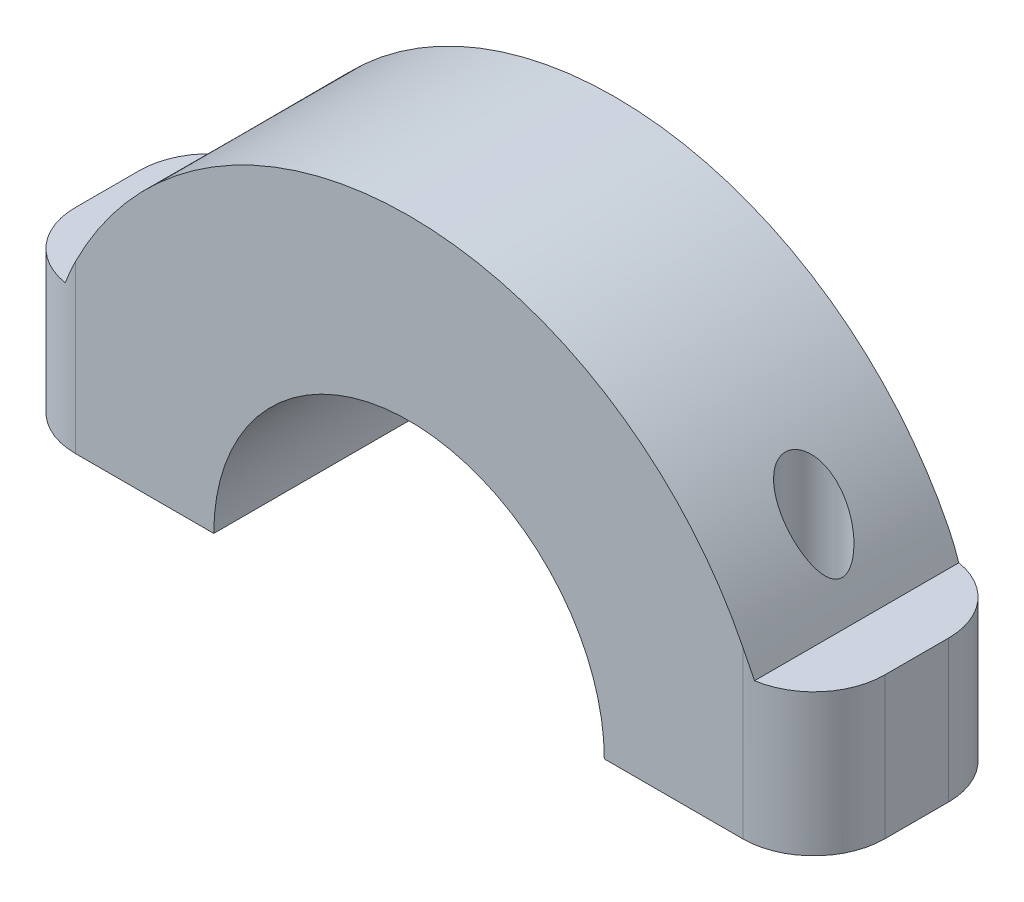
ISO-10303-21;
HEADER;
FILE_DESCRIPTION(('STEP AP214'),'2;1');
FILE_NAME('part.step','',(''),(''),'','','');
FILE_SCHEMA(('AUTOMOTIVE_DESIGN { 1 0 10303 214 1 1 1 1 }'));
ENDSEC;
DATA;
#1=APPLICATION_CONTEXT('core data for automotive mechanical design processes');
#2=APPLICATION_PROTOCOL_DEFINITION('international standard','automotive_design',2000,#1);
#3=PRODUCT_CONTEXT('',#1,'mechanical');
#4=PRODUCT('Part','Part','',(#3));
#5=PRODUCT_RELATED_PRODUCT_CATEGORY('part','',(#4));
#6=PRODUCT_DEFINITION_FORMATION('','',#4);
#7=PRODUCT_DEFINITION_CONTEXT('part definition',#1,'design');
#8=PRODUCT_DEFINITION('design','',#6,#7);
#9=PRODUCT_DEFINITION_SHAPE('','',#8);
#10=(LENGTH_UNIT() NAMED_UNIT(*) SI_UNIT(.MILLI.,.METRE.));
#11=(NAMED_UNIT(*) PLANE_ANGLE_UNIT() SI_UNIT($,.RADIAN.));
#12=(NAMED_UNIT(*) SI_UNIT($,.STERADIAN.) SOLID_ANGLE_UNIT());
#13=UNCERTAINTY_MEASURE_WITH_UNIT(LENGTH_MEASURE(1.E-05),#10,'distance_accuracy_value','');
#14=(GEOMETRIC_REPRESENTATION_CONTEXT(3) GLOBAL_UNCERTAINTY_ASSIGNED_CONTEXT((#13)) GLOBAL_UNIT_ASSIGNED_CONTEXT((#10,
#11,#12)) REPRESENTATION_CONTEXT('',''));
#15=CARTESIAN_POINT('',(0.,0.,0.));
#16=DIRECTION('',(0.,0.,1.));
#17=DIRECTION('',(1.,0.,0.));
#18=AXIS2_PLACEMENT_3D('',#15,#16,#17);
#19=CARTESIAN_POINT('',(-11.4,4.,-2.9));
#20=DIRECTION('',(1.,0.,0.));
#21=DIRECTION('',(0.,0.,-1.));
#22=AXIS2_PLACEMENT_3D('',#19,#20,#21);
#23=PLANE('',#22);
#24=DIRECTION('',(0.,0.,1.));
#25=VECTOR('',#24,1.);
#26=CARTESIAN_POINT('',(-11.4,4.,-2.9));
#27=LINE('',#26,#25);
#28=CARTESIAN_POINT('',(-11.4,4.,-0.900000000000001));
#29=VERTEX_POINT('',#28);
#30=CARTESIAN_POINT('',(-11.4,4.,0.900000000000002));
#31=VERTEX_POINT('',#30);
#32=EDGE_CURVE('E177',#29,#31,#27,.T.);
#33=ORIENTED_EDGE('',*,*,#32,.F.);
#34=DIRECTION('',(0.,-1.,0.));
#35=VECTOR('',#34,1.);
#36=CARTESIAN_POINT('',(-11.4,4.,-0.900000000000001));
#37=LINE('',#36,#35);
#38=CARTESIAN_POINT('',(-11.4,0.,-0.900000000000001));
#39=VERTEX_POINT('',#38);
#40=EDGE_CURVE('E320',#29,#39,#37,.T.);
#41=ORIENTED_EDGE('',*,*,#40,.T.);
#42=DIRECTION('',(0.,0.,1.));
#43=VECTOR('',#42,1.);
#44=CARTESIAN_POINT('',(-11.4,0.,-2.9));
#45=LINE('',#44,#43);
#46=CARTESIAN_POINT('',(-11.4,0.,0.900000000000002));
#47=VERTEX_POINT('',#46);
#48=EDGE_CURVE('E175',#39,#47,#45,.T.);
#49=ORIENTED_EDGE('',*,*,#48,.T.);
#50=DIRECTION('',(0.,-1.,0.));
#51=VECTOR('',#50,1.);
#52=CARTESIAN_POINT('',(-11.4,4.,0.900000000000002));
#53=LINE('',#52,#51);
#54=EDGE_CURVE('E69',#47,#31,#53,.F.);
#55=ORIENTED_EDGE('',*,*,#54,.T.);
#56=EDGE_LOOP('',(#33,#41,#49,#55));
#57=FACE_BOUND('',#56,.T.);
#58=ADVANCED_FACE('F47',(#57),#23,.F.);
#59=CARTESIAN_POINT('',(-11.4,4.,2.9));
#60=DIRECTION('',(0.,0.,-1.));
#61=DIRECTION('',(-1.,0.,0.));
#62=AXIS2_PLACEMENT_3D('',#59,#60,#61);
#63=PLANE('',#62);
#64=DIRECTION('',(1.,0.,0.));
#65=VECTOR('',#64,1.);
#66=CARTESIAN_POINT('',(5.5,0.,2.9));
#67=LINE('',#66,#65);
#68=CARTESIAN_POINT('',(5.5,0.,2.9));
#69=VERTEX_POINT('',#68);
#70=CARTESIAN_POINT('',(9.4,0.,2.9));
#71=VERTEX_POINT('',#70);
#72=EDGE_CURVE('E154',#69,#71,#67,.T.);
#73=ORIENTED_EDGE('',*,*,#72,.T.);
#74=DIRECTION('',(0.,-1.,0.));
#75=VECTOR('',#74,1.);
#76=CARTESIAN_POINT('',(9.4,4.,2.9));
#77=LINE('',#76,#75);
#78=CARTESIAN_POINT('',(9.4,4.67867502611583,2.9));
#79=VERTEX_POINT('',#78);
#80=EDGE_CURVE('E314',#71,#79,#77,.F.);
#81=ORIENTED_EDGE('',*,*,#80,.T.);
#82=CARTESIAN_POINT('',(0.,0.,2.9));
#83=DIRECTION('',(0.,0.,1.));
#84=DIRECTION('',(1.,0.,0.));
#85=AXIS2_PLACEMENT_3D('',#82,#83,#84);
#86=CIRCLE('',#85,10.5);
#87=CARTESIAN_POINT('',(-9.4,4.67867502611583,2.9));
#88=VERTEX_POINT('',#87);
#89=EDGE_CURVE('E164',#79,#88,#86,.T.);
#90=ORIENTED_EDGE('',*,*,#89,.T.);
#91=DIRECTION('',(0.,-1.,0.));
#92=VECTOR('',#91,1.);
#93=CARTESIAN_POINT('',(-9.4,4.,2.9));
#94=LINE('',#93,#92);
#95=CARTESIAN_POINT('',(-9.4,0.,2.9));
#96=VERTEX_POINT('',#95);
#97=EDGE_CURVE('E311',#88,#96,#94,.T.);
#98=ORIENTED_EDGE('',*,*,#97,.T.);
#99=DIRECTION('',(1.,0.,0.));
#100=VECTOR('',#99,1.);
#101=CARTESIAN_POINT('',(-11.4,0.,2.9));
#102=LINE('',#101,#100);
#103=CARTESIAN_POINT('',(-5.5,0.,2.9));
#104=VERTEX_POINT('',#103);
#105=EDGE_CURVE('E162',#96,#104,#102,.T.);
#106=ORIENTED_EDGE('',*,*,#105,.T.);
#107=CARTESIAN_POINT('',(0.,0.,2.9));
#108=DIRECTION('',(0.,0.,-1.));
#109=DIRECTION('',(1.,0.,0.));
#110=AXIS2_PLACEMENT_3D('',#107,#108,#109);
#111=CIRCLE('',#110,5.5);
#112=EDGE_CURVE('E148',#104,#69,#111,.T.);
#113=ORIENTED_EDGE('',*,*,#112,.T.);
#114=EDGE_LOOP('',(#73,#81,#90,#98,#106,#113));
#115=FACE_BOUND('',#114,.T.);
#116=ADVANCED_FACE('F158',(#115),#63,.F.);
#117=CARTESIAN_POINT('',(-11.4,4.,-2.9));
#118=DIRECTION('',(0.,0.,1.));
#119=DIRECTION('',(1.,0.,0.));
#120=AXIS2_PLACEMENT_3D('',#117,#118,#119);
#121=PLANE('',#120);
#122=CARTESIAN_POINT('',(0.,0.,-2.9));
#123=DIRECTION('',(0.,0.,1.));
#124=DIRECTION('',(1.,0.,0.));
#125=AXIS2_PLACEMENT_3D('',#122,#123,#124);
#126=CIRCLE('',#125,10.5);
#127=CARTESIAN_POINT('',(-9.4,4.67867502611583,-2.9));
#128=VERTEX_POINT('',#127);
#129=CARTESIAN_POINT('',(9.4,4.67867502611583,-2.9));
#130=VERTEX_POINT('',#129);
#131=EDGE_CURVE('E176',#128,#130,#126,.F.);
#132=ORIENTED_EDGE('',*,*,#131,.T.);
#133=DIRECTION('',(0.,-1.,0.));
#134=VECTOR('',#133,1.);
#135=CARTESIAN_POINT('',(9.4,4.,-2.9));
#136=LINE('',#135,#134);
#137=CARTESIAN_POINT('',(9.4,0.,-2.9));
#138=VERTEX_POINT('',#137);
#139=EDGE_CURVE('E188',#130,#138,#136,.T.);
#140=ORIENTED_EDGE('',*,*,#139,.T.);
#141=DIRECTION('',(-1.,0.,0.));
#142=VECTOR('',#141,1.);
#143=CARTESIAN_POINT('',(5.49999999999999,0.,-2.9));
#144=LINE('',#143,#142);
#145=CARTESIAN_POINT('',(5.5,0.,-2.9));
#146=VERTEX_POINT('',#145);
#147=EDGE_CURVE('E332',#138,#146,#144,.T.);
#148=ORIENTED_EDGE('',*,*,#147,.T.);
#149=CARTESIAN_POINT('',(0.,0.,-2.9));
#150=DIRECTION('',(0.,0.,1.));
#151=DIRECTION('',(1.,0.,0.));
#152=AXIS2_PLACEMENT_3D('',#149,#150,#151);
#153=CIRCLE('',#152,5.5);
#154=CARTESIAN_POINT('',(-5.5,0.,-2.9));
#155=VERTEX_POINT('',#154);
#156=EDGE_CURVE('E150',#146,#155,#153,.T.);
#157=ORIENTED_EDGE('',*,*,#156,.T.);
#158=DIRECTION('',(-1.,0.,0.));
#159=VECTOR('',#158,1.);
#160=CARTESIAN_POINT('',(-11.4,0.,-2.9));
#161=LINE('',#160,#159);
#162=CARTESIAN_POINT('',(-9.4,0.,-2.9));
#163=VERTEX_POINT('',#162);
#164=EDGE_CURVE('E180',#155,#163,#161,.T.);
#165=ORIENTED_EDGE('',*,*,#164,.T.);
#166=DIRECTION('',(0.,-1.,0.));
#167=VECTOR('',#166,1.);
#168=CARTESIAN_POINT('',(-9.4,4.,-2.9));
#169=LINE('',#168,#167);
#170=EDGE_CURVE('E179',#163,#128,#169,.F.);
#171=ORIENTED_EDGE('',*,*,#170,.T.);
#172=EDGE_LOOP('',(#132,#140,#148,#157,#165,#171));
#173=FACE_BOUND('',#172,.T.);
#174=ADVANCED_FACE('F284',(#173),#121,.F.);
#175=CARTESIAN_POINT('',(0.,4.,0.));
#176=DIRECTION('',(0.,1.,0.));
#177=DIRECTION('',(0.,0.,1.));
#178=AXIS2_PLACEMENT_3D('',#175,#176,#177);
#179=PLANE('',#178);
#180=DIRECTION('',(0.,0.,1.));
#181=VECTOR('',#180,1.);
#182=CARTESIAN_POINT('',(-9.7082439194738,4.,-26.3787137637478));
#183=LINE('',#182,#181);
#184=CARTESIAN_POINT('',(-9.7082439194738,4.,-2.87610366279389));
#185=VERTEX_POINT('',#184);
#186=CARTESIAN_POINT('',(-9.7082439194738,4.,2.87610366279389));
#187=VERTEX_POINT('',#186);
#188=EDGE_CURVE('E172',#185,#187,#183,.T.);
#189=ORIENTED_EDGE('',*,*,#188,.F.);
#190=CARTESIAN_POINT('',(-9.4,4.,-0.900000000000001));
#191=DIRECTION('',(0.,1.,0.));
#192=DIRECTION('',(0.,0.,1.));
#193=AXIS2_PLACEMENT_3D('',#190,#191,#192);
#194=CIRCLE('',#193,2.);
#195=EDGE_CURVE('E11',#185,#29,#194,.T.);
#196=ORIENTED_EDGE('',*,*,#195,.T.);
#197=ORIENTED_EDGE('',*,*,#32,.T.);
#198=CARTESIAN_POINT('',(-9.4,4.,0.900000000000002));
#199=DIRECTION('',(0.,1.,0.));
#200=DIRECTION('',(0.,0.,1.));
#201=AXIS2_PLACEMENT_3D('',#198,#199,#200);
#202=CIRCLE('',#201,2.);
#203=EDGE_CURVE('E62',#31,#187,#202,.T.);
#204=ORIENTED_EDGE('',*,*,#203,.T.);
#205=EDGE_LOOP('',(#189,#196,#197,#204));
#206=FACE_BOUND('',#205,.T.);
#207=ADVANCED_FACE('F223',(#206),#179,.T.);
#208=CARTESIAN_POINT('',(0.,0.,0.));
#209=DIRECTION('',(0.,1.,0.));
#210=DIRECTION('',(0.,0.,1.));
#211=AXIS2_PLACEMENT_3D('',#208,#209,#210);
#212=PLANE('',#211);
#213=CARTESIAN_POINT('',(-8.5,0.,0.));
#214=DIRECTION('',(0.,-1.,0.));
#215=DIRECTION('',(0.,0.,-1.));
#216=AXIS2_PLACEMENT_3D('',#213,#214,#215);
#217=CIRCLE('',#216,0.799999999999999);
#218=CARTESIAN_POINT('',(-8.5,0.,-0.799999999999999));
#219=VERTEX_POINT('',#218);
#220=EDGE_CURVE('E357',#219,#219,#217,.T.);
#221=ORIENTED_EDGE('',*,*,#220,.F.);
#222=EDGE_LOOP('',(#221));
#223=FACE_BOUND('',#222,.T.);
#224=ORIENTED_EDGE('',*,*,#48,.F.);
#225=CARTESIAN_POINT('',(-9.4,0.,-0.900000000000001));
#226=DIRECTION('',(0.,1.,0.));
#227=DIRECTION('',(0.,0.,1.));
#228=AXIS2_PLACEMENT_3D('',#225,#226,#227);
#229=CIRCLE('',#228,2.);
#230=EDGE_CURVE('E325',#39,#163,#229,.F.);
#231=ORIENTED_EDGE('',*,*,#230,.T.);
#232=ORIENTED_EDGE('',*,*,#164,.F.);
#233=DIRECTION('',(0.,0.,-1.));
#234=VECTOR('',#233,1.);
#235=CARTESIAN_POINT('',(-5.5,0.,-2.9));
#236=LINE('',#235,#234);
#237=EDGE_CURVE('E183',#104,#155,#236,.T.);
#238=ORIENTED_EDGE('',*,*,#237,.F.);
#239=ORIENTED_EDGE('',*,*,#105,.F.);
#240=CARTESIAN_POINT('',(-9.4,0.,0.900000000000002));
#241=DIRECTION('',(0.,1.,0.));
#242=DIRECTION('',(0.,0.,1.));
#243=AXIS2_PLACEMENT_3D('',#240,#241,#242);
#244=CIRCLE('',#243,2.);
#245=EDGE_CURVE('E323',#96,#47,#244,.F.);
#246=ORIENTED_EDGE('',*,*,#245,.T.);
#247=EDGE_LOOP('',(#224,#231,#232,#238,#239,#246));
#248=FACE_BOUND('',#247,.T.);
#249=ADVANCED_FACE('F220',(#223,#248),#212,.F.);
#250=CARTESIAN_POINT('',(0.,0.,-26.3787137637478));
#251=DIRECTION('',(0.,0.,1.));
#252=DIRECTION('',(1.,0.,0.));
#253=AXIS2_PLACEMENT_3D('',#250,#251,#252);
#254=CYLINDRICAL_SURFACE('',#253,10.5);
#255=CARTESIAN_POINT('',(-8.5,6.16441400296897,-0.799999999999998));
#256=CARTESIAN_POINT('',(-8.53938230921826,6.11011164393056,-0.799995667058939));
#257=CARTESIAN_POINT('',(-8.57822604693465,6.05545277140872,-0.797100542658023));
#258=CARTESIAN_POINT('',(-8.65462526206773,5.94574865838177,-0.785865113880109));
#259=CARTESIAN_POINT('',(-8.69218010222402,5.89070324251177,-0.777522155657543));
#260=CARTESIAN_POINT('',(-8.76568288693367,5.7807585280746,-0.75556671591621));
#261=CARTESIAN_POINT('',(-8.80163390114138,5.72585915776474,-0.741964828961207));
#262=CARTESIAN_POINT('',(-8.87177675245249,5.61656368202384,-0.709420058989267));
#263=CARTESIAN_POINT('',(-8.90596978274315,5.56216725636022,-0.690480856673075));
#264=CARTESIAN_POINT('',(-8.97193138850125,5.45512144539016,-0.647162499674192));
#265=CARTESIAN_POINT('',(-9.00372525076364,5.40245864364013,-0.622855529766369));
#266=CARTESIAN_POINT('',(-9.06497927095098,5.29903269686104,-0.567888207087658));
#267=CARTESIAN_POINT('',(-9.09443952315398,5.24826947513255,-0.53722811116474));
#268=CARTESIAN_POINT('',(-9.14380347048783,5.16166116815548,-0.476112696354305));
#269=CARTESIAN_POINT('',(-9.16434522591717,5.12507345155729,-0.447237407830055));
#270=CARTESIAN_POINT('',(-9.20286742448477,5.05556992566667,-0.383864006944928));
#271=CARTESIAN_POINT('',(-9.22085521408805,5.02264364605246,-0.349382660466211));
#272=CARTESIAN_POINT('',(-9.24560857845415,4.97685315777581,-0.290805135686642));
#273=CARTESIAN_POINT('',(-9.25375738869135,4.96167525013481,-0.26911792268806));
#274=CARTESIAN_POINT('',(-9.26850336994778,4.93407416029849,-0.223550510193106));
#275=CARTESIAN_POINT('',(-9.27510237430912,4.92164772425717,-0.19967294876349));
#276=CARTESIAN_POINT('',(-9.28532037190155,4.90233878242787,-0.15402121625861));
#277=CARTESIAN_POINT('',(-9.28925375714128,4.89487561930247,-0.132567599295736));
#278=CARTESIAN_POINT('',(-9.29539313866994,4.88320700254326,-0.0885527742791024));
#279=CARTESIAN_POINT('',(-9.29760116548249,4.87899771957628,-0.0659929014919325));
#280=CARTESIAN_POINT('',(-9.30007342619743,4.87428376883318,-0.0202388046442382));
#281=CARTESIAN_POINT('',(-9.30032639559909,4.87380056975848,0.00295832384559541));
#282=CARTESIAN_POINT('',(-9.29882805283238,4.87665859176285,0.0490517777051029));
#283=CARTESIAN_POINT('',(-9.29707591106896,4.88000139581322,0.0719479746016522));
#284=CARTESIAN_POINT('',(-9.29198096602482,4.88969485793193,0.114871271465068));
#285=CARTESIAN_POINT('',(-9.28878143342439,4.89577439720848,0.134979178722845));
#286=CARTESIAN_POINT('',(-9.28109501869465,4.91033026027808,0.17403202725089));
#287=CARTESIAN_POINT('',(-9.27660772353876,4.91880735303044,0.192976593030048));
#288=CARTESIAN_POINT('',(-9.2629930031118,4.94442029748257,0.24270156798498));
#289=CARTESIAN_POINT('',(-9.25284389703319,4.96340957186507,0.272242566959133));
#290=CARTESIAN_POINT('',(-9.23039988742454,5.00502557248625,0.327747356816707));
#291=CARTESIAN_POINT('',(-9.21809753220289,5.0276649082075,0.353698145671407));
#292=CARTESIAN_POINT('',(-9.19317731444331,5.07307588966545,0.400165423389923));
#293=CARTESIAN_POINT('',(-9.18069528440074,5.09563927742364,0.420962874101893));
#294=CARTESIAN_POINT('',(-9.15473546362008,5.14213290656116,0.460300263373935));
#295=CARTESIAN_POINT('',(-9.14125685623435,5.1660642652014,0.478838316774326));
#296=CARTESIAN_POINT('',(-9.09957475607067,5.23935922921543,0.531532226702265));
#297=CARTESIAN_POINT('',(-9.07015368475099,5.29017110065668,0.562717515495878));
#298=CARTESIAN_POINT('',(-9.0117542297577,5.38899707210694,0.616049337987491));
#299=CARTESIAN_POINT('',(-8.98298348097309,5.43683936218572,0.638763047196662));
#300=CARTESIAN_POINT('',(-8.92375472677403,5.53351736667154,0.679503172968055));
#301=CARTESIAN_POINT('',(-8.89329546962843,5.58235380062138,0.697526054184579));
#302=CARTESIAN_POINT('',(-8.83087060858139,5.6805915003113,0.729212706762776));
#303=CARTESIAN_POINT('',(-8.7989024651905,5.72999360400645,0.742868805025596));
#304=CARTESIAN_POINT('',(-8.73366826329167,5.82894076084362,0.765895066374985));
#305=CARTESIAN_POINT('',(-8.70040214616339,5.87848582034815,0.775265035643562));
#306=CARTESIAN_POINT('',(-8.6310994260193,5.97980501297926,0.790017518304112));
#307=CARTESIAN_POINT('',(-8.59500649783345,6.031571912193,0.795186895373127));
#308=CARTESIAN_POINT('',(-8.52174909739849,6.13463858628406,0.800547459438573));
#309=CARTESIAN_POINT('',(-8.48458425601461,6.18593819204037,0.800736910502218));
#310=CARTESIAN_POINT('',(-8.40957392485977,6.28753042784684,0.795758477225146));
#311=CARTESIAN_POINT('',(-8.37173107352004,6.33782581327471,0.790608198067294));
#312=CARTESIAN_POINT('',(-8.29563670364176,6.43710476921916,0.7744335922446));
#313=CARTESIAN_POINT('',(-8.25738556587524,6.48608943413597,0.76341433757751));
#314=CARTESIAN_POINT('',(-8.17923764771199,6.58438970103759,0.734120362501852));
#315=CARTESIAN_POINT('',(-8.13934495339945,6.63361946024481,0.715539105204549));
#316=CARTESIAN_POINT('',(-8.06061643527969,6.72906182123948,0.670079248846651));
#317=CARTESIAN_POINT('',(-8.02177980424416,6.77527676756926,0.643207192806285));
#318=CARTESIAN_POINT('',(-7.95467282412646,6.85385034654135,0.586613496828741));
#319=CARTESIAN_POINT('',(-7.92590495917293,6.8870722882053,0.558696598382899));
#320=CARTESIAN_POINT('',(-7.87121198056199,6.94951314420968,0.496325847654923));
#321=CARTESIAN_POINT('',(-7.84528186646404,6.97873912332211,0.461883795878713));
#322=CARTESIAN_POINT('',(-7.80443614817949,7.02434677047676,0.396537845072164));
#323=CARTESIAN_POINT('',(-7.78844687339842,7.04205601428067,0.367238576041149));
#324=CARTESIAN_POINT('',(-7.75970845591257,7.07371055569373,0.305180233022698));
#325=CARTESIAN_POINT('',(-7.74695772899704,7.08765769383194,0.272422861791029));
#326=CARTESIAN_POINT('',(-7.72550605786124,7.11103465655023,0.203637227359355));
#327=CARTESIAN_POINT('',(-7.71684749788761,7.12041723214443,0.167579160317324));
#328=CARTESIAN_POINT('',(-7.70461866155955,7.13364820486413,0.0936313430993682));
#329=CARTESIAN_POINT('',(-7.70104223265725,7.13750329374663,0.0557438652343915));
#330=CARTESIAN_POINT('',(-7.69948042095171,7.13918760460836,-0.0144557121390647));
#331=CARTESIAN_POINT('',(-7.70072409861725,7.13784771070183,-0.0467349657235745));
#332=CARTESIAN_POINT('',(-7.70701774432383,7.13105173221518,-0.110471781488884));
#333=CARTESIAN_POINT('',(-7.71206761347144,7.12559575458019,-0.141929364996556));
#334=CARTESIAN_POINT('',(-7.7253644641777,7.11117674167486,-0.202138178577725));
#335=CARTESIAN_POINT('',(-7.73349881765156,7.10233715982996,-0.230944744052242));
#336=CARTESIAN_POINT('',(-7.75247636290661,7.08161760277346,-0.286480465185496));
#337=CARTESIAN_POINT('',(-7.76332054750284,7.06973651318967,-0.31320885473583));
#338=CARTESIAN_POINT('',(-7.79264421013778,7.03742556338408,-0.375940036191655));
#339=CARTESIAN_POINT('',(-7.81235330342268,7.01556511336638,-0.41063310809973));
#340=CARTESIAN_POINT('',(-7.85500665096926,6.96777612151473,-0.474844468392748));
#341=CARTESIAN_POINT('',(-7.87795820286146,6.94183838789174,-0.504350737362646));
#342=CARTESIAN_POINT('',(-7.9366653189888,6.87474338382829,-0.570424790703306));
#343=CARTESIAN_POINT('',(-7.97357462021205,6.83194877705238,-0.604294319694553));
#344=CARTESIAN_POINT('',(-8.04954080534833,6.74228314143511,-0.662866498713073));
#345=CARTESIAN_POINT('',(-8.08860113455137,6.6954054986074,-0.687553920809635));
#346=CARTESIAN_POINT('',(-8.18991663401834,6.57151080420931,-0.740770825628272));
#347=CARTESIAN_POINT('',(-8.2527479782525,6.49249481530309,-0.763521620251327));
#348=CARTESIAN_POINT('',(-8.37748052218167,6.33074582383066,-0.793163660559265));
#349=CARTESIAN_POINT('',(-8.43937832888729,6.24800228957826,-0.800006669749261));
#350=CARTESIAN_POINT('',(-8.5,6.16441400296897,-0.799999999999998));
#351=B_SPLINE_CURVE_WITH_KNOTS('',3,(#255,#256,#257,#258,#259,#260,#261,#262,#263,#264,#265,
#266,#267,#268,#269,#270,#271,#272,#273,#274,#275,#276,#277,#278,#279,#280,#281,#282,#283,#284,
#285,#286,#287,#288,#289,#290,#291,#292,#293,#294,#295,#296,#297,#298,#299,#300,#301,#302,#303,
#304,#305,#306,#307,#308,#309,#310,#311,#312,#313,#314,#315,#316,#317,#318,#319,#320,#321,#322,
#323,#324,#325,#326,#327,#328,#329,#330,#331,#332,#333,#334,#335,#336,#337,#338,#339,#340,#341,
#342,#343,#344,#345,#346,#347,#348,#349,#350),.UNSPECIFIED.,.T.,.F.,(4,2,2,2,2,2,2,2,2,2,2,2,2,
2,2,2,2,2,2,2,2,2,2,2,2,2,2,2,2,2,2,2,2,2,2,2,2,2,2,2,2,2,2,2,2,2,2,4),(0.,0.20113602006788,
0.402370094255048,0.603200859928887,0.803893466885269,1.00203583126769,1.20017018659474,
1.35265943060785,1.50470074602287,1.58759429981671,1.67038929516414,1.739274683764,
1.80807888056211,1.87727921471381,1.94650819017853,2.01002151839308,2.07355524017017,
2.18258670318262,2.29200323090912,2.39124035587845,2.49055972198035,2.68943087774194,
2.87003222486423,3.05076929457421,3.23182222343968,3.41288333867733,3.60264094575541,
3.79246469881323,3.98166458383229,4.17070122604653,4.36831563468829,4.56577448510545,
4.72147069187295,4.87688796995068,4.98983956067903,5.10273579163978,5.21677701116177,
5.33068005172587,5.42717542639621,5.52366829398543,5.61693253715426,5.71023100025951,
5.84595624854377,5.98199198260493,6.17854696998434,6.37542649277905,6.68410286083312,
6.99371400094935),.UNSPECIFIED.);
#352=CARTESIAN_POINT('',(-8.5,6.16441400296897,-0.799999999999998));
#353=VERTEX_POINT('',#352);
#354=EDGE_CURVE('E52',#353,#353,#351,.T.);
#355=ORIENTED_EDGE('',*,*,#354,.F.);
#356=EDGE_LOOP('',(#355));
#357=FACE_BOUND('',#356,.T.);
#358=CARTESIAN_POINT('',(8.5,6.16441400296897,-0.799999999999998));
#359=CARTESIAN_POINT('',(8.4660326781306,6.21125097139232,-0.799999910672586));
#360=CARTESIAN_POINT('',(8.43167616232628,6.25780841456076,-0.797841639005048));
#361=CARTESIAN_POINT('',(8.36239943382051,6.35008692408337,-0.78885150718799));
#362=CARTESIAN_POINT('',(8.32747902526548,6.39580768754195,-0.782017987571779));
#363=CARTESIAN_POINT('',(8.25755101300266,6.48583734289946,-0.7632327846887));
#364=CARTESIAN_POINT('',(8.22254432241015,6.5301511667233,-0.75130176244072));
#365=CARTESIAN_POINT('',(8.1528066732315,6.61701125649987,-0.721726961955046));
#366=CARTESIAN_POINT('',(8.11807544485834,6.65955948794161,-0.704089739540734));
#367=CARTESIAN_POINT('',(8.05155561243392,6.73980770756455,-0.663569882228171));
#368=CARTESIAN_POINT('',(8.01971356554688,6.77764572485675,-0.641053426823172));
#369=CARTESIAN_POINT('',(7.95775769511304,6.85028192853252,-0.589570390558288));
#370=CARTESIAN_POINT('',(7.92764268613708,6.88508220877983,-0.560608302235582));
#371=CARTESIAN_POINT('',(7.87537291791061,6.94476778213727,-0.501127655424758));
#372=CARTESIAN_POINT('',(7.85273749667971,6.97033098743136,-0.471721877651883));
#373=CARTESIAN_POINT('',(7.81068149599262,7.01742456765855,-0.407795733065352));
#374=CARTESIAN_POINT('',(7.79125595182426,7.03896117743581,-0.37328342426332));
#375=CARTESIAN_POINT('',(7.76099956968442,7.07228898016652,-0.307984426829671));
#376=CARTESIAN_POINT('',(7.74922075828519,7.08518165439129,-0.278203300646292));
#377=CARTESIAN_POINT('',(7.72907054200902,7.10715777300652,-0.216167649910844));
#378=CARTESIAN_POINT('',(7.72069682928266,7.1162437975297,-0.183914818267838));
#379=CARTESIAN_POINT('',(7.70794481063014,7.13005457023947,-0.117470213338365));
#380=CARTESIAN_POINT('',(7.70359348734044,7.13474986733842,-0.0832669566305039));
#381=CARTESIAN_POINT('',(7.6993820150897,7.1392946098418,-0.0142664004785223));
#382=CARTESIAN_POINT('',(7.69952003132281,7.13914603495046,0.0205306504685896));
#383=CARTESIAN_POINT('',(7.70401464929796,7.13429503686698,0.0858224919854582));
#384=CARTESIAN_POINT('',(7.70792794574959,7.13007114518154,0.116386206006135));
#385=CARTESIAN_POINT('',(7.71904553777505,7.11803361092298,0.176167342276705));
#386=CARTESIAN_POINT('',(7.7262502439911,7.11021952042948,0.205384596038915));
#387=CARTESIAN_POINT('',(7.74382936876271,7.09107045177211,0.262958164101525));
#388=CARTESIAN_POINT('',(7.75431426305582,7.07961248312861,0.291239066342945));
#389=CARTESIAN_POINT('',(7.77777270267707,7.05383276175977,0.345338757284509));
#390=CARTESIAN_POINT('',(7.79074752523724,7.03950953911495,0.37115627214663));
#391=CARTESIAN_POINT('',(7.82640487506076,6.99988781155936,0.433814475879982));
#392=CARTESIAN_POINT('',(7.85047564701813,6.97291304219708,0.468809469820802));
#393=CARTESIAN_POINT('',(7.90166790308348,6.91485040761364,0.532616670601256));
#394=CARTESIAN_POINT('',(7.928797029555,6.88375220283245,0.561412841262087));
#395=CARTESIAN_POINT('',(7.99835468872033,6.80296565456384,0.625741324601983));
#396=CARTESIAN_POINT('',(8.04187519180505,6.75152032250079,0.65787002486067));
#397=CARTESIAN_POINT('',(8.13044166918076,6.64460476879784,0.711414692319926));
#398=CARTESIAN_POINT('',(8.17549006401756,6.58912798474824,0.732812723681711));
#399=CARTESIAN_POINT('',(8.25475547809319,6.48937864334293,0.762352251094205));
#400=CARTESIAN_POINT('',(8.28895282086084,6.44564739136564,0.772449374190849));
#401=CARTESIAN_POINT('',(8.35704587945185,6.35711509484291,0.787897728023183));
#402=CARTESIAN_POINT('',(8.39094142879633,6.31231350465818,0.79324648272174));
#403=CARTESIAN_POINT('',(8.49187315143313,6.17662978380412,0.802819428267001));
#404=CARTESIAN_POINT('',(8.55806363103245,6.08458272732563,0.800539374607576));
#405=CARTESIAN_POINT('',(8.6557577375751,5.9440163822958,0.78541760583581));
#406=CARTESIAN_POINT('',(8.68869304501388,5.89576123919197,0.778156516213454));
#407=CARTESIAN_POINT('',(8.75339710556036,5.79925869191213,0.759554867089793));
#408=CARTESIAN_POINT('',(8.7851663252037,5.75101129250272,0.748215959113118));
#409=CARTESIAN_POINT('',(8.84730104450248,5.6549562011192,0.721472794952955));
#410=CARTESIAN_POINT('',(8.87767042006658,5.607147630431,0.706080668986378));
#411=CARTESIAN_POINT('',(8.93692835151566,5.5122080439664,0.671028201970356));
#412=CARTESIAN_POINT('',(8.96581779799426,5.46507663327411,0.651370466084934));
#413=CARTESIAN_POINT('',(9.01904788813368,5.37672379624658,0.60960240227157));
#414=CARTESIAN_POINT('',(9.04355243782075,5.335388541327,0.587944367447279));
#415=CARTESIAN_POINT('',(9.09097770023119,5.25417314279787,0.540258350979449));
#416=CARTESIAN_POINT('',(9.11389510455559,5.21429611591105,0.514221607363633));
#417=CARTESIAN_POINT('',(9.15786096227057,5.13669081555747,0.456673233984453));
#418=CARTESIAN_POINT('',(9.17888585239436,5.09899129917531,0.425104052797962));
#419=CARTESIAN_POINT('',(9.21780431925475,5.02828824567434,0.355444857573715));
#420=CARTESIAN_POINT('',(9.23571291074833,4.99526234294867,0.317387965129162));
#421=CARTESIAN_POINT('',(9.25836691288633,4.9530684629342,0.255579906526965));
#422=CARTESIAN_POINT('',(9.26507052725379,4.94050930435031,0.234881938722879));
#423=CARTESIAN_POINT('',(9.27702071942342,4.91803278880325,0.191679413334466));
#424=CARTESIAN_POINT('',(9.28226795464771,4.90811423992882,0.169175676823055));
#425=CARTESIAN_POINT('',(9.29096231367075,4.89163664774663,0.122280261241203));
#426=CARTESIAN_POINT('',(9.29438665865134,4.88512013478665,0.0978688734199921));
#427=CARTESIAN_POINT('',(9.29894269949476,4.8764424165335,0.0480816945932805));
#428=CARTESIAN_POINT('',(9.30007815169246,4.8742740754236,0.0227075534300047));
#429=CARTESIAN_POINT('',(9.29992319557295,4.87456945667568,-0.0248972037227928));
#430=CARTESIAN_POINT('',(9.2989116152417,4.87650077418166,-0.0471339826265726));
#431=CARTESIAN_POINT('',(9.29512293065523,4.88371845060608,-0.0909017674018866));
#432=CARTESIAN_POINT('',(9.29234429681147,4.88900771620898,-0.112432144805112));
#433=CARTESIAN_POINT('',(9.28429612658478,4.90427744042299,-0.160036154839201));
#434=CARTESIAN_POINT('',(9.27855300048815,4.91514561712059,-0.185740535017722));
#435=CARTESIAN_POINT('',(9.2651743139887,4.94031871947267,-0.234861404109205));
#436=CARTESIAN_POINT('',(9.25753474367842,4.95463092531208,-0.258272896677616));
#437=CARTESIAN_POINT('',(9.23555686403832,4.99552884874077,-0.316973336894402));
#438=CARTESIAN_POINT('',(9.22004148225471,5.02414475309707,-0.350387226989285));
#439=CARTESIAN_POINT('',(9.18655692607431,5.08511511625983,-0.412161739925552));
#440=CARTESIAN_POINT('',(9.16858083241735,5.117480076076,-0.440507574295637));
#441=CARTESIAN_POINT('',(9.13175379317728,5.18289641167705,-0.491765151863229));
#442=CARTESIAN_POINT('',(9.11298345007428,5.21584435843699,-0.514869438315751));
#443=CARTESIAN_POINT('',(9.07416405790834,5.28309204187512,-0.55782846670853));
#444=CARTESIAN_POINT('',(9.05411391469402,5.31739292539664,-0.57768037492225));
#445=CARTESIAN_POINT('',(8.99231944416658,5.42168752918451,-0.633003995022451));
#446=CARTESIAN_POINT('',(8.94896190785083,5.49301808157351,-0.664203277319952));
#447=CARTESIAN_POINT('',(8.87302116140688,5.61452874965444,-0.708610862714349));
#448=CARTESIAN_POINT('',(8.84130006535089,5.66435974082861,-0.724395005378545));
#449=CARTESIAN_POINT('',(8.77643841222618,5.76434495087915,-0.751545093465331));
#450=CARTESIAN_POINT('',(8.74329734107574,5.81449928113691,-0.76290942349435));
#451=CARTESIAN_POINT('',(8.67574043874246,5.91482818654206,-0.781243205643077));
#452=CARTESIAN_POINT('',(8.64132325677993,5.96500272411865,-0.788207851395488));
#453=CARTESIAN_POINT('',(8.57141574170455,6.06502704186978,-0.797585993569537));
#454=CARTESIAN_POINT('',(8.53592555176459,6.11487686430203,-0.800000094477171));
#455=CARTESIAN_POINT('',(8.5,6.16441400296897,-0.799999999999998));
#456=B_SPLINE_CURVE_WITH_KNOTS('',3,(#358,#359,#360,#361,#362,#363,#364,#365,#366,#367,#368,
#369,#370,#371,#372,#373,#374,#375,#376,#377,#378,#379,#380,#381,#382,#383,#384,#385,#386,#387,
#388,#389,#390,#391,#392,#393,#394,#395,#396,#397,#398,#399,#400,#401,#402,#403,#404,#405,#406,
#407,#408,#409,#410,#411,#412,#413,#414,#415,#416,#417,#418,#419,#420,#421,#422,#423,#424,#425,
#426,#427,#428,#429,#430,#431,#432,#433,#434,#435,#436,#437,#438,#439,#440,#441,#442,#443,#444,
#445,#446,#447,#448,#449,#450,#451,#452,#453,#454,#455),.UNSPECIFIED.,.T.,.F.,(4,2,2,2,2,2,2,2,
2,2,2,2,2,2,2,2,2,2,2,2,2,2,2,2,2,2,2,2,2,2,2,2,2,2,2,2,2,2,2,2,2,2,2,2,2,2,2,2,4),(0.,
0.17352684055216,0.347115305966399,0.520006765573603,0.69270029229335,0.855315737167348,
1.01781819381296,1.15253636169989,1.28704417024032,1.39021173324175,1.49330925608702,
1.59709345377336,1.70083523509546,1.79371265216451,1.88660165995368,1.98303569889914,
2.07951933745544,2.22961216183239,2.38008872604965,2.60281075626342,2.82590382595134,
2.99495443910354,3.16409315202235,3.50281251388381,3.6793264435386,3.85576896505618,
4.03168932604579,4.20750254692351,4.36544792019602,4.52371319339246,4.6837348289161,
4.84296271943111,4.91813693283961,4.99327715656271,5.06933551180796,5.14526894464144,
5.21194651721673,5.27868188562642,5.36368147528729,5.44886234516157,5.58802383801234,
5.72758499941124,5.86059902430724,5.99372833209825,6.26020954584201,6.44349777829273,
6.62685293779093,6.81040805598863,6.9939387893438),.UNSPECIFIED.);
#457=CARTESIAN_POINT('',(8.5,6.16441400296897,-0.799999999999998));
#458=VERTEX_POINT('',#457);
#459=EDGE_CURVE('E245',#458,#458,#456,.T.);
#460=ORIENTED_EDGE('',*,*,#459,.F.);
#461=EDGE_LOOP('',(#460));
#462=FACE_BOUND('',#461,.T.);
#463=DIRECTION('',(0.,0.,1.));
#464=VECTOR('',#463,1.);
#465=CARTESIAN_POINT('',(9.7082439194738,4.,-26.3787137637478));
#466=LINE('',#465,#464);
#467=CARTESIAN_POINT('',(9.7082439194738,4.,-2.87610366279389));
#468=VERTEX_POINT('',#467);
#469=CARTESIAN_POINT('',(9.7082439194738,4.,2.87610366279389));
#470=VERTEX_POINT('',#469);
#471=EDGE_CURVE('E253',#468,#470,#466,.T.);
#472=ORIENTED_EDGE('',*,*,#471,.F.);
#473=CARTESIAN_POINT('',(9.7082439194738,4.,-2.87610366279389));
#474=CARTESIAN_POINT('',(9.68459596332499,4.05739535137765,-2.87979166035894));
#475=CARTESIAN_POINT('',(9.66043028210392,4.11460155028137,-2.88312706503788));
#476=CARTESIAN_POINT('',(9.61108534320612,4.2285804269601,-2.88898484366635));
#477=CARTESIAN_POINT('',(9.58590663389013,4.2853533200015,-2.89150765099444));
#478=CARTESIAN_POINT('',(9.53453188877015,4.39847249015623,-2.89563658431972));
#479=CARTESIAN_POINT('',(9.50833583955091,4.45481876163216,-2.89724269822447));
#480=CARTESIAN_POINT('',(9.45492553558464,4.56708336712202,-2.89942412832984));
#481=CARTESIAN_POINT('',(9.42771074401329,4.62300145626763,-2.89999889302952));
#482=CARTESIAN_POINT('',(9.4,4.67867502611583,-2.9));
#483=B_SPLINE_CURVE_WITH_KNOTS('',3,(#473,#474,#475,#476,#477,#478,#479,#480,#481,#482),
.UNSPECIFIED.,.F.,.F.,(4,2,2,2,4),(0.,0.186555482486462,0.373011304869532,0.55946958680375,
0.746027545267178),.UNSPECIFIED.);
#484=EDGE_CURVE('E237',#468,#130,#483,.T.);
#485=ORIENTED_EDGE('',*,*,#484,.T.);
#486=ORIENTED_EDGE('',*,*,#131,.F.);
#487=CARTESIAN_POINT('',(-9.4,4.67867502611583,-2.9));
#488=CARTESIAN_POINT('',(-9.42771074401329,4.62300145626762,-2.89999889302952));
#489=CARTESIAN_POINT('',(-9.45492553558464,4.56708336712202,-2.89942412832984));
#490=CARTESIAN_POINT('',(-9.50833583955091,4.45481876163216,-2.89724269822447));
#491=CARTESIAN_POINT('',(-9.53453188877015,4.39847249015623,-2.89563658431973));
#492=CARTESIAN_POINT('',(-9.58590663389014,4.2853533200015,-2.89150765099444));
#493=CARTESIAN_POINT('',(-9.61108534320612,4.2285804269601,-2.88898484366635));
#494=CARTESIAN_POINT('',(-9.66043028210392,4.11460155028137,-2.88312706503789));
#495=CARTESIAN_POINT('',(-9.68459596332499,4.05739535137765,-2.87979166035894));
#496=CARTESIAN_POINT('',(-9.7082439194738,4.,-2.87610366279389));
#497=B_SPLINE_CURVE_WITH_KNOTS('',3,(#487,#488,#489,#490,#491,#492,#493,#494,#495,#496),
.UNSPECIFIED.,.F.,.F.,(4,2,2,2,4),(0.,0.186557958463428,0.373016240397644,0.559472062780714,
0.746027545267174),.UNSPECIFIED.);
#498=EDGE_CURVE('E209',#128,#185,#497,.T.);
#499=ORIENTED_EDGE('',*,*,#498,.T.);
#500=ORIENTED_EDGE('',*,*,#188,.T.);
#501=CARTESIAN_POINT('',(-9.7082439194738,4.,2.87610366279389));
#502=CARTESIAN_POINT('',(-9.68459596332499,4.05739535137765,2.87979166035894));
#503=CARTESIAN_POINT('',(-9.66043028210392,4.11460155028137,2.88312706503789));
#504=CARTESIAN_POINT('',(-9.61108534320612,4.2285804269601,2.88898484366635));
#505=CARTESIAN_POINT('',(-9.58590663389014,4.2853533200015,2.89150765099444));
#506=CARTESIAN_POINT('',(-9.53453188877015,4.39847249015623,2.89563658431973));
#507=CARTESIAN_POINT('',(-9.50833583955091,4.45481876163216,2.89724269822447));
#508=CARTESIAN_POINT('',(-9.45492553558464,4.56708336712202,2.89942412832984));
#509=CARTESIAN_POINT('',(-9.42771074401329,4.62300145626762,2.89999889302952));
#510=CARTESIAN_POINT('',(-9.4,4.67867502611583,2.9));
#511=B_SPLINE_CURVE_WITH_KNOTS('',3,(#501,#502,#503,#504,#505,#506,#507,#508,#509,#510),
.UNSPECIFIED.,.F.,.F.,(4,2,2,2,4),(0.,0.186555482486461,0.373011304869529,0.559469586803748,
0.746027545267175),.UNSPECIFIED.);
#512=EDGE_CURVE('E203',#187,#88,#511,.T.);
#513=ORIENTED_EDGE('',*,*,#512,.T.);
#514=ORIENTED_EDGE('',*,*,#89,.F.);
#515=CARTESIAN_POINT('',(9.4,4.67867502611583,2.9));
#516=CARTESIAN_POINT('',(9.42771074401329,4.62300145626762,2.89999889302951));
#517=CARTESIAN_POINT('',(9.45492553558464,4.56708336712202,2.89942412832984));
#518=CARTESIAN_POINT('',(9.50833583955091,4.45481876163216,2.89724269822447));
#519=CARTESIAN_POINT('',(9.53453188877015,4.39847249015623,2.89563658431972));
#520=CARTESIAN_POINT('',(9.58590663389014,4.2853533200015,2.89150765099444));
#521=CARTESIAN_POINT('',(9.61108534320612,4.2285804269601,2.88898484366634));
#522=CARTESIAN_POINT('',(9.66043028210392,4.11460155028137,2.88312706503788));
#523=CARTESIAN_POINT('',(9.68459596332499,4.05739535137765,2.87979166035893));
#524=CARTESIAN_POINT('',(9.7082439194738,4.,2.87610366279389));
#525=B_SPLINE_CURVE_WITH_KNOTS('',3,(#515,#516,#517,#518,#519,#520,#521,#522,#523,#524),
.UNSPECIFIED.,.F.,.F.,(4,2,2,2,4),(0.,0.186557958463428,0.373016240397644,0.559472062780714,
0.746027545267174),.UNSPECIFIED.);
#526=EDGE_CURVE('E230',#79,#470,#525,.T.);
#527=ORIENTED_EDGE('',*,*,#526,.T.);
#528=EDGE_LOOP('',(#472,#485,#486,#499,#500,#513,#514,#527));
#529=FACE_BOUND('',#528,.T.);
#530=ADVANCED_FACE('F215',(#357,#462,#529),#254,.T.);
#531=CARTESIAN_POINT('',(5.5,0.,-26.3787137637478));
#532=DIRECTION('',(0.,-1.,0.));
#533=DIRECTION('',(0.,0.,-1.));
#534=AXIS2_PLACEMENT_3D('',#531,#532,#533);
#535=PLANE('',#534);
#536=CARTESIAN_POINT('',(8.5,0.,0.));
#537=DIRECTION('',(0.,-1.,0.));
#538=DIRECTION('',(0.,0.,-1.));
#539=AXIS2_PLACEMENT_3D('',#536,#537,#538);
#540=CIRCLE('',#539,0.799999999999999);
#541=CARTESIAN_POINT('',(8.5,0.,-0.799999999999999));
#542=VERTEX_POINT('',#541);
#543=EDGE_CURVE('E254',#542,#542,#540,.T.);
#544=ORIENTED_EDGE('',*,*,#543,.F.);
#545=EDGE_LOOP('',(#544));
#546=FACE_BOUND('',#545,.T.);
#547=ORIENTED_EDGE('',*,*,#147,.F.);
#548=CARTESIAN_POINT('',(9.4,0.,-0.899999999999997));
#549=DIRECTION('',(0.,-1.,0.));
#550=DIRECTION('',(0.,0.,-1.));
#551=AXIS2_PLACEMENT_3D('',#548,#549,#550);
#552=CIRCLE('',#551,2.);
#553=CARTESIAN_POINT('',(11.4,0.,-0.899999999999998));
#554=VERTEX_POINT('',#553);
#555=EDGE_CURVE('E192',#138,#554,#552,.T.);
#556=ORIENTED_EDGE('',*,*,#555,.T.);
#557=DIRECTION('',(0.,0.,1.));
#558=VECTOR('',#557,1.);
#559=CARTESIAN_POINT('',(11.4,0.,-2.9));
#560=LINE('',#559,#558);
#561=CARTESIAN_POINT('',(11.4,0.,0.899999999999996));
#562=VERTEX_POINT('',#561);
#563=EDGE_CURVE('E336',#554,#562,#560,.T.);
#564=ORIENTED_EDGE('',*,*,#563,.T.);
#565=CARTESIAN_POINT('',(9.4,0.,0.899999999999996));
#566=DIRECTION('',(0.,-1.,0.));
#567=DIRECTION('',(0.,0.,-1.));
#568=AXIS2_PLACEMENT_3D('',#565,#566,#567);
#569=CIRCLE('',#568,2.);
#570=EDGE_CURVE('E168',#562,#71,#569,.T.);
#571=ORIENTED_EDGE('',*,*,#570,.T.);
#572=ORIENTED_EDGE('',*,*,#72,.F.);
#573=DIRECTION('',(0.,0.,1.));
#574=VECTOR('',#573,1.);
#575=CARTESIAN_POINT('',(5.5,0.,-26.3787137637478));
#576=LINE('',#575,#574);
#577=EDGE_CURVE('E144',#146,#69,#576,.T.);
#578=ORIENTED_EDGE('',*,*,#577,.F.);
#579=EDGE_LOOP('',(#547,#556,#564,#571,#572,#578));
#580=FACE_BOUND('',#579,.T.);
#581=ADVANCED_FACE('F166',(#546,#580),#535,.T.);
#582=CARTESIAN_POINT('',(0.,0.,-26.3787137637478));
#583=DIRECTION('',(0.,0.,1.));
#584=DIRECTION('',(1.,0.,0.));
#585=AXIS2_PLACEMENT_3D('',#582,#583,#584);
#586=CYLINDRICAL_SURFACE('',#585,5.5);
#587=ORIENTED_EDGE('',*,*,#156,.F.);
#588=ORIENTED_EDGE('',*,*,#577,.T.);
#589=ORIENTED_EDGE('',*,*,#112,.F.);
#590=ORIENTED_EDGE('',*,*,#237,.T.);
#591=EDGE_LOOP('',(#587,#588,#589,#590));
#592=FACE_BOUND('',#591,.T.);
#593=ADVANCED_FACE('F146',(#592),#586,.F.);
#594=CARTESIAN_POINT('',(11.4,4.,-2.9));
#595=DIRECTION('',(-1.,0.,0.));
#596=DIRECTION('',(0.,0.,-1.));
#597=AXIS2_PLACEMENT_3D('',#594,#595,#596);
#598=PLANE('',#597);
#599=ORIENTED_EDGE('',*,*,#563,.F.);
#600=DIRECTION('',(0.,-1.,0.));
#601=VECTOR('',#600,1.);
#602=CARTESIAN_POINT('',(11.4,4.,-0.899999999999998));
#603=LINE('',#602,#601);
#604=CARTESIAN_POINT('',(11.4,4.,-0.899999999999998));
#605=VERTEX_POINT('',#604);
#606=EDGE_CURVE('E197',#554,#605,#603,.F.);
#607=ORIENTED_EDGE('',*,*,#606,.T.);
#608=DIRECTION('',(0.,0.,1.));
#609=VECTOR('',#608,1.);
#610=CARTESIAN_POINT('',(11.4,4.,-2.9));
#611=LINE('',#610,#609);
#612=CARTESIAN_POINT('',(11.4,4.,0.899999999999996));
#613=VERTEX_POINT('',#612);
#614=EDGE_CURVE('E338',#605,#613,#611,.T.);
#615=ORIENTED_EDGE('',*,*,#614,.T.);
#616=DIRECTION('',(0.,-1.,0.));
#617=VECTOR('',#616,1.);
#618=CARTESIAN_POINT('',(11.4,4.,0.899999999999996));
#619=LINE('',#618,#617);
#620=EDGE_CURVE('E194',#613,#562,#619,.T.);
#621=ORIENTED_EDGE('',*,*,#620,.T.);
#622=EDGE_LOOP('',(#599,#607,#615,#621));
#623=FACE_BOUND('',#622,.T.);
#624=ADVANCED_FACE('F268',(#623),#598,.F.);
#625=CARTESIAN_POINT('',(0.,4.,0.));
#626=DIRECTION('',(0.,1.,0.));
#627=DIRECTION('',(0.,0.,1.));
#628=AXIS2_PLACEMENT_3D('',#625,#626,#627);
#629=PLANE('',#628);
#630=ORIENTED_EDGE('',*,*,#614,.F.);
#631=CARTESIAN_POINT('',(9.4,4.,-0.899999999999997));
#632=DIRECTION('',(0.,1.,0.));
#633=DIRECTION('',(0.,0.,1.));
#634=AXIS2_PLACEMENT_3D('',#631,#632,#633);
#635=CIRCLE('',#634,2.);
#636=EDGE_CURVE('E201',#605,#468,#635,.T.);
#637=ORIENTED_EDGE('',*,*,#636,.T.);
#638=ORIENTED_EDGE('',*,*,#471,.T.);
#639=CARTESIAN_POINT('',(9.4,4.,0.899999999999996));
#640=DIRECTION('',(0.,1.,0.));
#641=DIRECTION('',(0.,0.,1.));
#642=AXIS2_PLACEMENT_3D('',#639,#640,#641);
#643=CIRCLE('',#642,2.);
#644=EDGE_CURVE('E199',#470,#613,#643,.T.);
#645=ORIENTED_EDGE('',*,*,#644,.T.);
#646=EDGE_LOOP('',(#630,#637,#638,#645));
#647=FACE_BOUND('',#646,.T.);
#648=ADVANCED_FACE('F264',(#647),#629,.T.);
#649=CARTESIAN_POINT('',(9.4,4.,-0.899999999999997));
#650=DIRECTION('',(0.,-1.,0.));
#651=DIRECTION('',(0.,0.,-1.));
#652=AXIS2_PLACEMENT_3D('',#649,#650,#651);
#653=CYLINDRICAL_SURFACE('',#652,2.);
#654=ORIENTED_EDGE('',*,*,#636,.F.);
#655=ORIENTED_EDGE('',*,*,#606,.F.);
#656=ORIENTED_EDGE('',*,*,#555,.F.);
#657=ORIENTED_EDGE('',*,*,#139,.F.);
#658=ORIENTED_EDGE('',*,*,#484,.F.);
#659=EDGE_LOOP('',(#654,#655,#656,#657,#658));
#660=FACE_BOUND('',#659,.T.);
#661=ADVANCED_FACE('F267',(#660),#653,.T.);
#662=CARTESIAN_POINT('',(9.4,4.,0.899999999999996));
#663=DIRECTION('',(0.,-1.,0.));
#664=DIRECTION('',(0.,0.,-1.));
#665=AXIS2_PLACEMENT_3D('',#662,#663,#664);
#666=CYLINDRICAL_SURFACE('',#665,2.);
#667=ORIENTED_EDGE('',*,*,#526,.F.);
#668=ORIENTED_EDGE('',*,*,#80,.F.);
#669=ORIENTED_EDGE('',*,*,#570,.F.);
#670=ORIENTED_EDGE('',*,*,#620,.F.);
#671=ORIENTED_EDGE('',*,*,#644,.F.);
#672=EDGE_LOOP('',(#667,#668,#669,#670,#671));
#673=FACE_BOUND('',#672,.T.);
#674=ADVANCED_FACE('F289',(#673),#666,.T.);
#675=CARTESIAN_POINT('',(-9.4,4.,-0.900000000000001));
#676=DIRECTION('',(0.,-1.,0.));
#677=DIRECTION('',(0.,0.,-1.));
#678=AXIS2_PLACEMENT_3D('',#675,#676,#677);
#679=CYLINDRICAL_SURFACE('',#678,2.);
#680=ORIENTED_EDGE('',*,*,#498,.F.);
#681=ORIENTED_EDGE('',*,*,#170,.F.);
#682=ORIENTED_EDGE('',*,*,#230,.F.);
#683=ORIENTED_EDGE('',*,*,#40,.F.);
#684=ORIENTED_EDGE('',*,*,#195,.F.);
#685=EDGE_LOOP('',(#680,#681,#682,#683,#684));
#686=FACE_BOUND('',#685,.T.);
#687=ADVANCED_FACE('F293',(#686),#679,.T.);
#688=CARTESIAN_POINT('',(-9.4,4.,0.900000000000002));
#689=DIRECTION('',(0.,-1.,0.));
#690=DIRECTION('',(0.,0.,-1.));
#691=AXIS2_PLACEMENT_3D('',#688,#689,#690);
#692=CYLINDRICAL_SURFACE('',#691,2.);
#693=ORIENTED_EDGE('',*,*,#203,.F.);
#694=ORIENTED_EDGE('',*,*,#54,.F.);
#695=ORIENTED_EDGE('',*,*,#245,.F.);
#696=ORIENTED_EDGE('',*,*,#97,.F.);
#697=ORIENTED_EDGE('',*,*,#512,.F.);
#698=EDGE_LOOP('',(#693,#694,#695,#696,#697));
#699=FACE_BOUND('',#698,.T.);
#700=ADVANCED_FACE('F49',(#699),#692,.T.);
#701=CARTESIAN_POINT('',(8.5,0.,0.));
#702=DIRECTION('',(0.,-1.,0.));
#703=DIRECTION('',(0.,0.,-1.));
#704=AXIS2_PLACEMENT_3D('',#701,#702,#703);
#705=CYLINDRICAL_SURFACE('',#704,0.799999999999998);
#706=ORIENTED_EDGE('',*,*,#459,.T.);
#707=EDGE_LOOP('',(#706));
#708=FACE_BOUND('',#707,.T.);
#709=ORIENTED_EDGE('',*,*,#543,.T.);
#710=EDGE_LOOP('',(#709));
#711=FACE_BOUND('',#710,.T.);
#712=ADVANCED_FACE('F257',(#708,#711),#705,.F.);
#713=CARTESIAN_POINT('',(-8.5,0.,0.));
#714=DIRECTION('',(0.,-1.,0.));
#715=DIRECTION('',(0.,0.,-1.));
#716=AXIS2_PLACEMENT_3D('',#713,#714,#715);
#717=CYLINDRICAL_SURFACE('',#716,0.799999999999998);
#718=ORIENTED_EDGE('',*,*,#354,.T.);
#719=EDGE_LOOP('',(#718));
#720=FACE_BOUND('',#719,.T.);
#721=ORIENTED_EDGE('',*,*,#220,.T.);
#722=EDGE_LOOP('',(#721));
#723=FACE_BOUND('',#722,.T.);
#724=ADVANCED_FACE('F261',(#720,#723),#717,.F.);
#725=CLOSED_SHELL('',(#58,#116,#174,#207,#249,#530,#581,#593,#624,#648,#661,#674,#687,#700,#712,#724));
#726=MANIFOLD_SOLID_BREP('B2',#725);
#727=ADVANCED_BREP_SHAPE_REPRESENTATION('',(#18,#726),#14);
#728=SHAPE_DEFINITION_REPRESENTATION(#9,#727);
ENDSEC;
END-ISO-10303-21;
